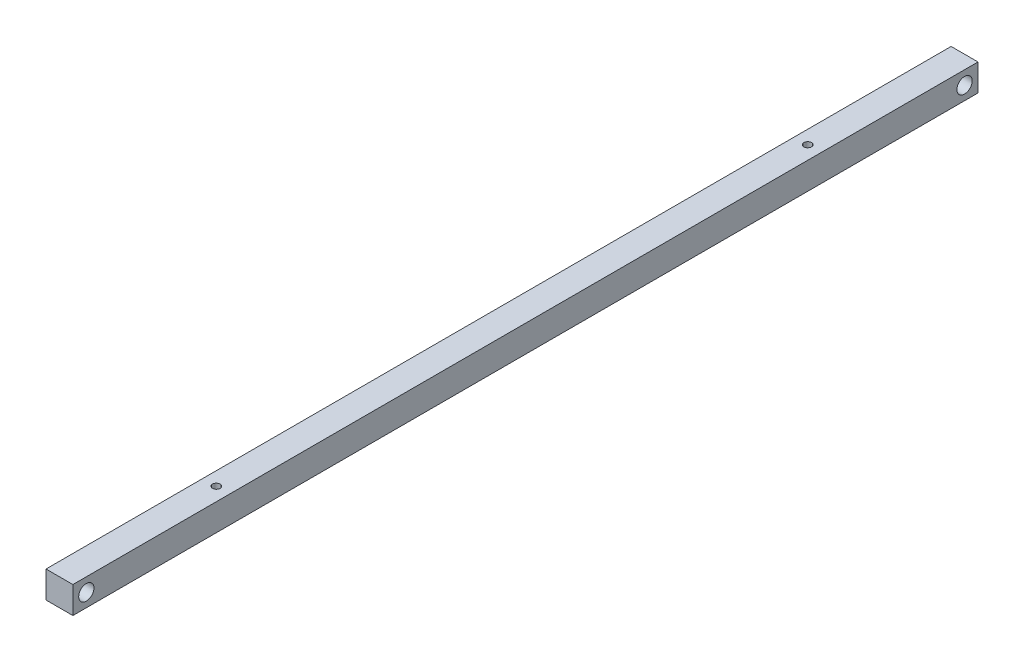
ISO-10303-21;
HEADER;
FILE_DESCRIPTION(('STEP AP214'),'2;1');
FILE_NAME('part.step','',(''),(''),'','','');
FILE_SCHEMA(('AUTOMOTIVE_DESIGN { 1 0 10303 214 1 1 1 1 }'));
ENDSEC;
DATA;
#1=APPLICATION_CONTEXT('core data for automotive mechanical design processes');
#2=APPLICATION_PROTOCOL_DEFINITION('international standard','automotive_design',2000,#1);
#3=PRODUCT_CONTEXT('',#1,'mechanical');
#4=PRODUCT('Part','Part','',(#3));
#5=PRODUCT_RELATED_PRODUCT_CATEGORY('part','',(#4));
#6=PRODUCT_DEFINITION_FORMATION('','',#4);
#7=PRODUCT_DEFINITION_CONTEXT('part definition',#1,'design');
#8=PRODUCT_DEFINITION('design','',#6,#7);
#9=PRODUCT_DEFINITION_SHAPE('','',#8);
#10=(LENGTH_UNIT() NAMED_UNIT(*) SI_UNIT(.MILLI.,.METRE.));
#11=(NAMED_UNIT(*) PLANE_ANGLE_UNIT() SI_UNIT($,.RADIAN.));
#12=(NAMED_UNIT(*) SI_UNIT($,.STERADIAN.) SOLID_ANGLE_UNIT());
#13=UNCERTAINTY_MEASURE_WITH_UNIT(LENGTH_MEASURE(1.E-05),#10,'distance_accuracy_value','');
#14=(GEOMETRIC_REPRESENTATION_CONTEXT(3) GLOBAL_UNCERTAINTY_ASSIGNED_CONTEXT((#13)) GLOBAL_UNIT_ASSIGNED_CONTEXT((#10,
#11,#12)) REPRESENTATION_CONTEXT('',''));
#15=CARTESIAN_POINT('',(0.,0.,0.));
#16=DIRECTION('',(0.,0.,1.));
#17=DIRECTION('',(1.,0.,0.));
#18=AXIS2_PLACEMENT_3D('',#15,#16,#17);
#19=CARTESIAN_POINT('',(7.5,-7.5,252.5));
#20=DIRECTION('',(-1.,0.,0.));
#21=DIRECTION('',(0.,0.,1.));
#22=AXIS2_PLACEMENT_3D('',#19,#20,#21);
#23=PLANE('',#22);
#24=CARTESIAN_POINT('',(7.5,0.,-245.));
#25=DIRECTION('',(-1.,0.,0.));
#26=DIRECTION('',(0.,0.,1.));
#27=AXIS2_PLACEMENT_3D('',#24,#25,#26);
#28=CIRCLE('',#27,4.25000000000001);
#29=CARTESIAN_POINT('',(7.5,0.,-240.75));
#30=VERTEX_POINT('',#29);
#31=EDGE_CURVE('E132',#30,#30,#28,.T.);
#32=ORIENTED_EDGE('',*,*,#31,.T.);
#33=EDGE_LOOP('',(#32));
#34=FACE_BOUND('',#33,.T.);
#35=CARTESIAN_POINT('',(7.5,0.,245.));
#36=DIRECTION('',(-1.,0.,0.));
#37=DIRECTION('',(0.,0.,1.));
#38=AXIS2_PLACEMENT_3D('',#35,#36,#37);
#39=CIRCLE('',#38,4.25000000000001);
#40=CARTESIAN_POINT('',(7.5,0.,249.25));
#41=VERTEX_POINT('',#40);
#42=EDGE_CURVE('E110',#41,#41,#39,.T.);
#43=ORIENTED_EDGE('',*,*,#42,.T.);
#44=EDGE_LOOP('',(#43));
#45=FACE_BOUND('',#44,.T.);
#46=DIRECTION('',(0.,1.,0.));
#47=VECTOR('',#46,1.);
#48=CARTESIAN_POINT('',(7.5,-7.5,-252.5));
#49=LINE('',#48,#47);
#50=CARTESIAN_POINT('',(7.5,-7.5,-252.5));
#51=VERTEX_POINT('',#50);
#52=CARTESIAN_POINT('',(7.5,7.5,-252.5));
#53=VERTEX_POINT('',#52);
#54=EDGE_CURVE('E107',#51,#53,#49,.T.);
#55=ORIENTED_EDGE('',*,*,#54,.T.);
#56=DIRECTION('',(0.,0.,-1.));
#57=VECTOR('',#56,1.);
#58=CARTESIAN_POINT('',(7.5,7.5,252.5));
#59=LINE('',#58,#57);
#60=CARTESIAN_POINT('',(7.5,7.5,252.5));
#61=VERTEX_POINT('',#60);
#62=EDGE_CURVE('E11',#61,#53,#59,.T.);
#63=ORIENTED_EDGE('',*,*,#62,.F.);
#64=DIRECTION('',(0.,1.,0.));
#65=VECTOR('',#64,1.);
#66=CARTESIAN_POINT('',(7.5,-7.5,252.5));
#67=LINE('',#66,#65);
#68=CARTESIAN_POINT('',(7.5,-7.5,252.5));
#69=VERTEX_POINT('',#68);
#70=EDGE_CURVE('E95',#69,#61,#67,.T.);
#71=ORIENTED_EDGE('',*,*,#70,.F.);
#72=DIRECTION('',(0.,0.,-1.));
#73=VECTOR('',#72,1.);
#74=CARTESIAN_POINT('',(7.5,-7.5,252.5));
#75=LINE('',#74,#73);
#76=EDGE_CURVE('E103',#69,#51,#75,.T.);
#77=ORIENTED_EDGE('',*,*,#76,.T.);
#78=EDGE_LOOP('',(#55,#63,#71,#77));
#79=FACE_BOUND('',#78,.T.);
#80=ADVANCED_FACE('F44',(#34,#45,#79),#23,.F.);
#81=CARTESIAN_POINT('',(-7.5,7.5,252.5));
#82=DIRECTION('',(0.,-1.,0.));
#83=DIRECTION('',(0.,0.,-1.));
#84=AXIS2_PLACEMENT_3D('',#81,#82,#83);
#85=PLANE('',#84);
#86=CARTESIAN_POINT('',(0.,7.5,-165.));
#87=DIRECTION('',(0.,-1.,0.));
#88=DIRECTION('',(0.,0.,-1.));
#89=AXIS2_PLACEMENT_3D('',#86,#87,#88);
#90=CIRCLE('',#89,2.1);
#91=CARTESIAN_POINT('',(0.,7.5,-167.1));
#92=VERTEX_POINT('',#91);
#93=EDGE_CURVE('E153',#92,#92,#90,.T.);
#94=ORIENTED_EDGE('',*,*,#93,.T.);
#95=EDGE_LOOP('',(#94));
#96=FACE_BOUND('',#95,.T.);
#97=CARTESIAN_POINT('',(0.,7.5,165.));
#98=DIRECTION('',(0.,-1.,0.));
#99=DIRECTION('',(0.,0.,-1.));
#100=AXIS2_PLACEMENT_3D('',#97,#98,#99);
#101=CIRCLE('',#100,2.1);
#102=CARTESIAN_POINT('',(0.,7.5,162.9));
#103=VERTEX_POINT('',#102);
#104=EDGE_CURVE('E144',#103,#103,#101,.T.);
#105=ORIENTED_EDGE('',*,*,#104,.T.);
#106=EDGE_LOOP('',(#105));
#107=FACE_BOUND('',#106,.T.);
#108=DIRECTION('',(-1.,0.,0.));
#109=VECTOR('',#108,1.);
#110=CARTESIAN_POINT('',(-7.5,7.5,-252.5));
#111=LINE('',#110,#109);
#112=CARTESIAN_POINT('',(-7.5,7.5,-252.5));
#113=VERTEX_POINT('',#112);
#114=EDGE_CURVE('E99',#53,#113,#111,.T.);
#115=ORIENTED_EDGE('',*,*,#114,.T.);
#116=DIRECTION('',(0.,0.,-1.));
#117=VECTOR('',#116,1.);
#118=CARTESIAN_POINT('',(-7.5,7.5,252.5));
#119=LINE('',#118,#117);
#120=CARTESIAN_POINT('',(-7.5,7.5,252.5));
#121=VERTEX_POINT('',#120);
#122=EDGE_CURVE('E52',#121,#113,#119,.T.);
#123=ORIENTED_EDGE('',*,*,#122,.F.);
#124=DIRECTION('',(-1.,0.,0.));
#125=VECTOR('',#124,1.);
#126=CARTESIAN_POINT('',(-7.5,7.5,252.5));
#127=LINE('',#126,#125);
#128=EDGE_CURVE('E90',#61,#121,#127,.T.);
#129=ORIENTED_EDGE('',*,*,#128,.F.);
#130=ORIENTED_EDGE('',*,*,#62,.T.);
#131=EDGE_LOOP('',(#115,#123,#129,#130));
#132=FACE_BOUND('',#131,.T.);
#133=ADVANCED_FACE('F98',(#96,#107,#132),#85,.F.);
#134=CARTESIAN_POINT('',(-7.5,-7.5,252.5));
#135=DIRECTION('',(1.,0.,0.));
#136=DIRECTION('',(0.,0.,-1.));
#137=AXIS2_PLACEMENT_3D('',#134,#135,#136);
#138=PLANE('',#137);
#139=CARTESIAN_POINT('',(-7.5,0.,-245.));
#140=DIRECTION('',(-1.,0.,0.));
#141=DIRECTION('',(0.,0.,1.));
#142=AXIS2_PLACEMENT_3D('',#139,#140,#141);
#143=CIRCLE('',#142,7.00000000000001);
#144=CARTESIAN_POINT('',(-7.5,0.,-238.));
#145=VERTEX_POINT('',#144);
#146=EDGE_CURVE('E141',#145,#145,#143,.T.);
#147=ORIENTED_EDGE('',*,*,#146,.F.);
#148=EDGE_LOOP('',(#147));
#149=FACE_BOUND('',#148,.T.);
#150=CARTESIAN_POINT('',(-7.5,0.,245.));
#151=DIRECTION('',(-1.,0.,0.));
#152=DIRECTION('',(0.,0.,1.));
#153=AXIS2_PLACEMENT_3D('',#150,#151,#152);
#154=CIRCLE('',#153,7.00000000000001);
#155=CARTESIAN_POINT('',(-7.5,0.,252.));
#156=VERTEX_POINT('',#155);
#157=EDGE_CURVE('E129',#156,#156,#154,.T.);
#158=ORIENTED_EDGE('',*,*,#157,.F.);
#159=EDGE_LOOP('',(#158));
#160=FACE_BOUND('',#159,.T.);
#161=DIRECTION('',(0.,-1.,0.));
#162=VECTOR('',#161,1.);
#163=CARTESIAN_POINT('',(-7.5,-7.5,-252.5));
#164=LINE('',#163,#162);
#165=CARTESIAN_POINT('',(-7.5,-7.5,-252.5));
#166=VERTEX_POINT('',#165);
#167=EDGE_CURVE('E77',#113,#166,#164,.T.);
#168=ORIENTED_EDGE('',*,*,#167,.T.);
#169=DIRECTION('',(0.,0.,-1.));
#170=VECTOR('',#169,1.);
#171=CARTESIAN_POINT('',(-7.5,-7.5,252.5));
#172=LINE('',#171,#170);
#173=CARTESIAN_POINT('',(-7.5,-7.5,252.5));
#174=VERTEX_POINT('',#173);
#175=EDGE_CURVE('E100',#174,#166,#172,.T.);
#176=ORIENTED_EDGE('',*,*,#175,.F.);
#177=DIRECTION('',(0.,-1.,0.));
#178=VECTOR('',#177,1.);
#179=CARTESIAN_POINT('',(-7.5,-7.5,252.5));
#180=LINE('',#179,#178);
#181=EDGE_CURVE('E93',#121,#174,#180,.T.);
#182=ORIENTED_EDGE('',*,*,#181,.F.);
#183=ORIENTED_EDGE('',*,*,#122,.T.);
#184=EDGE_LOOP('',(#168,#176,#182,#183));
#185=FACE_BOUND('',#184,.T.);
#186=ADVANCED_FACE('F101',(#149,#160,#185),#138,.F.);
#187=CARTESIAN_POINT('',(-7.5,-7.5,252.5));
#188=DIRECTION('',(0.,1.,0.));
#189=DIRECTION('',(0.,0.,1.));
#190=AXIS2_PLACEMENT_3D('',#187,#188,#189);
#191=PLANE('',#190);
#192=CARTESIAN_POINT('',(0.,-7.5,-165.));
#193=DIRECTION('',(0.,-1.,0.));
#194=DIRECTION('',(0.,0.,-1.));
#195=AXIS2_PLACEMENT_3D('',#192,#193,#194);
#196=CIRCLE('',#195,2.525);
#197=CARTESIAN_POINT('',(0.,-7.5,-167.525));
#198=VERTEX_POINT('',#197);
#199=EDGE_CURVE('E159',#198,#198,#196,.T.);
#200=ORIENTED_EDGE('',*,*,#199,.F.);
#201=EDGE_LOOP('',(#200));
#202=FACE_BOUND('',#201,.T.);
#203=CARTESIAN_POINT('',(0.,-7.5,165.));
#204=DIRECTION('',(0.,-1.,0.));
#205=DIRECTION('',(0.,0.,-1.));
#206=AXIS2_PLACEMENT_3D('',#203,#204,#205);
#207=CIRCLE('',#206,2.525);
#208=CARTESIAN_POINT('',(0.,-7.5,162.475));
#209=VERTEX_POINT('',#208);
#210=EDGE_CURVE('E150',#209,#209,#207,.T.);
#211=ORIENTED_EDGE('',*,*,#210,.F.);
#212=EDGE_LOOP('',(#211));
#213=FACE_BOUND('',#212,.T.);
#214=DIRECTION('',(1.,0.,0.));
#215=VECTOR('',#214,1.);
#216=CARTESIAN_POINT('',(-7.5,-7.5,-252.5));
#217=LINE('',#216,#215);
#218=EDGE_CURVE('E83',#166,#51,#217,.T.);
#219=ORIENTED_EDGE('',*,*,#218,.T.);
#220=ORIENTED_EDGE('',*,*,#76,.F.);
#221=DIRECTION('',(1.,0.,0.));
#222=VECTOR('',#221,1.);
#223=CARTESIAN_POINT('',(-7.5,-7.5,252.5));
#224=LINE('',#223,#222);
#225=EDGE_CURVE('E60',#174,#69,#224,.T.);
#226=ORIENTED_EDGE('',*,*,#225,.F.);
#227=ORIENTED_EDGE('',*,*,#175,.T.);
#228=EDGE_LOOP('',(#219,#220,#226,#227));
#229=FACE_BOUND('',#228,.T.);
#230=ADVANCED_FACE('F115',(#202,#213,#229),#191,.F.);
#231=CARTESIAN_POINT('',(0.,0.,252.5));
#232=DIRECTION('',(0.,0.,-1.));
#233=DIRECTION('',(-1.,0.,0.));
#234=AXIS2_PLACEMENT_3D('',#231,#232,#233);
#235=PLANE('',#234);
#236=ORIENTED_EDGE('',*,*,#70,.T.);
#237=ORIENTED_EDGE('',*,*,#128,.T.);
#238=ORIENTED_EDGE('',*,*,#181,.T.);
#239=ORIENTED_EDGE('',*,*,#225,.T.);
#240=EDGE_LOOP('',(#236,#237,#238,#239));
#241=FACE_BOUND('',#240,.T.);
#242=ADVANCED_FACE('F91',(#241),#235,.F.);
#243=CARTESIAN_POINT('',(0.,0.,-252.5));
#244=DIRECTION('',(0.,0.,-1.));
#245=DIRECTION('',(-1.,0.,0.));
#246=AXIS2_PLACEMENT_3D('',#243,#244,#245);
#247=PLANE('',#246);
#248=ORIENTED_EDGE('',*,*,#54,.F.);
#249=ORIENTED_EDGE('',*,*,#218,.F.);
#250=ORIENTED_EDGE('',*,*,#167,.F.);
#251=ORIENTED_EDGE('',*,*,#114,.F.);
#252=EDGE_LOOP('',(#248,#249,#250,#251));
#253=FACE_BOUND('',#252,.T.);
#254=ADVANCED_FACE('F118',(#253),#247,.T.);
#255=CARTESIAN_POINT('',(-7.5,0.,245.));
#256=DIRECTION('',(-1.,0.,0.));
#257=DIRECTION('',(0.,0.,1.));
#258=AXIS2_PLACEMENT_3D('',#255,#256,#257);
#259=CYLINDRICAL_SURFACE('',#258,4.25000000000001);
#260=ORIENTED_EDGE('',*,*,#42,.F.);
#261=EDGE_LOOP('',(#260));
#262=FACE_BOUND('',#261,.T.);
#263=CARTESIAN_POINT('',(0.499999999999999,0.,245.));
#264=DIRECTION('',(-1.,0.,0.));
#265=DIRECTION('',(0.,0.,1.));
#266=AXIS2_PLACEMENT_3D('',#263,#264,#265);
#267=CIRCLE('',#266,4.25000000000001);
#268=CARTESIAN_POINT('',(0.499999999999999,0.,249.25));
#269=VERTEX_POINT('',#268);
#270=EDGE_CURVE('E123',#269,#269,#267,.T.);
#271=ORIENTED_EDGE('',*,*,#270,.T.);
#272=EDGE_LOOP('',(#271));
#273=FACE_BOUND('',#272,.T.);
#274=ADVANCED_FACE('F198',(#262,#273),#259,.F.);
#275=CARTESIAN_POINT('',(0.499999999999999,4.25000000000001,245.));
#276=DIRECTION('',(1.,0.,0.));
#277=DIRECTION('',(0.,0.,-1.));
#278=AXIS2_PLACEMENT_3D('',#275,#276,#277);
#279=PLANE('',#278);
#280=ORIENTED_EDGE('',*,*,#270,.F.);
#281=EDGE_LOOP('',(#280));
#282=FACE_BOUND('',#281,.T.);
#283=CARTESIAN_POINT('',(0.499999999999999,0.,245.));
#284=DIRECTION('',(-1.,0.,0.));
#285=DIRECTION('',(0.,0.,1.));
#286=AXIS2_PLACEMENT_3D('',#283,#284,#285);
#287=CIRCLE('',#286,7.00000000000001);
#288=CARTESIAN_POINT('',(0.499999999999999,0.,252.));
#289=VERTEX_POINT('',#288);
#290=EDGE_CURVE('E126',#289,#289,#287,.T.);
#291=ORIENTED_EDGE('',*,*,#290,.T.);
#292=EDGE_LOOP('',(#291));
#293=FACE_BOUND('',#292,.T.);
#294=ADVANCED_FACE('F201',(#282,#293),#279,.F.);
#295=CARTESIAN_POINT('',(-7.5,0.,245.));
#296=DIRECTION('',(-1.,0.,0.));
#297=DIRECTION('',(0.,0.,1.));
#298=AXIS2_PLACEMENT_3D('',#295,#296,#297);
#299=CYLINDRICAL_SURFACE('',#298,7.00000000000001);
#300=ORIENTED_EDGE('',*,*,#290,.F.);
#301=EDGE_LOOP('',(#300));
#302=FACE_BOUND('',#301,.T.);
#303=ORIENTED_EDGE('',*,*,#157,.T.);
#304=EDGE_LOOP('',(#303));
#305=FACE_BOUND('',#304,.T.);
#306=ADVANCED_FACE('F207',(#302,#305),#299,.F.);
#307=CARTESIAN_POINT('',(-7.5,0.,-245.));
#308=DIRECTION('',(-1.,0.,0.));
#309=DIRECTION('',(0.,0.,1.));
#310=AXIS2_PLACEMENT_3D('',#307,#308,#309);
#311=CYLINDRICAL_SURFACE('',#310,4.25000000000001);
#312=ORIENTED_EDGE('',*,*,#31,.F.);
#313=EDGE_LOOP('',(#312));
#314=FACE_BOUND('',#313,.T.);
#315=CARTESIAN_POINT('',(0.499999999999999,0.,-245.));
#316=DIRECTION('',(-1.,0.,0.));
#317=DIRECTION('',(0.,0.,1.));
#318=AXIS2_PLACEMENT_3D('',#315,#316,#317);
#319=CIRCLE('',#318,4.25000000000001);
#320=CARTESIAN_POINT('',(0.499999999999999,0.,-240.75));
#321=VERTEX_POINT('',#320);
#322=EDGE_CURVE('E135',#321,#321,#319,.T.);
#323=ORIENTED_EDGE('',*,*,#322,.T.);
#324=EDGE_LOOP('',(#323));
#325=FACE_BOUND('',#324,.T.);
#326=ADVANCED_FACE('F213',(#314,#325),#311,.F.);
#327=CARTESIAN_POINT('',(0.499999999999999,4.25000000000001,-245.));
#328=DIRECTION('',(1.,0.,0.));
#329=DIRECTION('',(0.,0.,-1.));
#330=AXIS2_PLACEMENT_3D('',#327,#328,#329);
#331=PLANE('',#330);
#332=ORIENTED_EDGE('',*,*,#322,.F.);
#333=EDGE_LOOP('',(#332));
#334=FACE_BOUND('',#333,.T.);
#335=CARTESIAN_POINT('',(0.499999999999999,0.,-245.));
#336=DIRECTION('',(-1.,0.,0.));
#337=DIRECTION('',(0.,0.,1.));
#338=AXIS2_PLACEMENT_3D('',#335,#336,#337);
#339=CIRCLE('',#338,7.00000000000001);
#340=CARTESIAN_POINT('',(0.499999999999999,0.,-238.));
#341=VERTEX_POINT('',#340);
#342=EDGE_CURVE('E138',#341,#341,#339,.T.);
#343=ORIENTED_EDGE('',*,*,#342,.T.);
#344=EDGE_LOOP('',(#343));
#345=FACE_BOUND('',#344,.T.);
#346=ADVANCED_FACE('F230',(#334,#345),#331,.F.);
#347=CARTESIAN_POINT('',(-7.5,0.,-245.));
#348=DIRECTION('',(-1.,0.,0.));
#349=DIRECTION('',(0.,0.,1.));
#350=AXIS2_PLACEMENT_3D('',#347,#348,#349);
#351=CYLINDRICAL_SURFACE('',#350,7.00000000000001);
#352=ORIENTED_EDGE('',*,*,#342,.F.);
#353=EDGE_LOOP('',(#352));
#354=FACE_BOUND('',#353,.T.);
#355=ORIENTED_EDGE('',*,*,#146,.T.);
#356=EDGE_LOOP('',(#355));
#357=FACE_BOUND('',#356,.T.);
#358=ADVANCED_FACE('F182',(#354,#357),#351,.F.);
#359=CARTESIAN_POINT('',(0.,-7.5,165.));
#360=DIRECTION('',(0.,-1.,0.));
#361=DIRECTION('',(0.,0.,-1.));
#362=AXIS2_PLACEMENT_3D('',#359,#360,#361);
#363=CYLINDRICAL_SURFACE('',#362,2.09999999999999);
#364=ORIENTED_EDGE('',*,*,#104,.F.);
#365=EDGE_LOOP('',(#364));
#366=FACE_BOUND('',#365,.T.);
#367=CARTESIAN_POINT('',(0.,-7.07499999999999,165.));
#368=DIRECTION('',(0.,-1.,0.));
#369=DIRECTION('',(0.,0.,-1.));
#370=AXIS2_PLACEMENT_3D('',#367,#368,#369);
#371=CIRCLE('',#370,2.09999999999999);
#372=CARTESIAN_POINT('',(0.,-7.07499999999999,162.9));
#373=VERTEX_POINT('',#372);
#374=EDGE_CURVE('E147',#373,#373,#371,.T.);
#375=ORIENTED_EDGE('',*,*,#374,.T.);
#376=EDGE_LOOP('',(#375));
#377=FACE_BOUND('',#376,.T.);
#378=ADVANCED_FACE('F173',(#366,#377),#363,.F.);
#379=CARTESIAN_POINT('',(0.,-7.5,165.));
#380=DIRECTION('',(0.,-1.,0.));
#381=DIRECTION('',(0.,0.,-1.));
#382=AXIS2_PLACEMENT_3D('',#379,#380,#381);
#383=CONICAL_SURFACE('',#382,2.525,0.78539816339745);
#384=ORIENTED_EDGE('',*,*,#374,.F.);
#385=EDGE_LOOP('',(#384));
#386=FACE_BOUND('',#385,.T.);
#387=ORIENTED_EDGE('',*,*,#210,.T.);
#388=EDGE_LOOP('',(#387));
#389=FACE_BOUND('',#388,.T.);
#390=ADVANCED_FACE('F170',(#386,#389),#383,.F.);
#391=CARTESIAN_POINT('',(0.,-7.5,-165.));
#392=DIRECTION('',(0.,-1.,0.));
#393=DIRECTION('',(0.,0.,-1.));
#394=AXIS2_PLACEMENT_3D('',#391,#392,#393);
#395=CYLINDRICAL_SURFACE('',#394,2.09999999999999);
#396=ORIENTED_EDGE('',*,*,#93,.F.);
#397=EDGE_LOOP('',(#396));
#398=FACE_BOUND('',#397,.T.);
#399=CARTESIAN_POINT('',(0.,-7.07499999999999,-165.));
#400=DIRECTION('',(0.,-1.,0.));
#401=DIRECTION('',(0.,0.,-1.));
#402=AXIS2_PLACEMENT_3D('',#399,#400,#401);
#403=CIRCLE('',#402,2.09999999999999);
#404=CARTESIAN_POINT('',(0.,-7.07499999999999,-167.1));
#405=VERTEX_POINT('',#404);
#406=EDGE_CURVE('E156',#405,#405,#403,.T.);
#407=ORIENTED_EDGE('',*,*,#406,.T.);
#408=EDGE_LOOP('',(#407));
#409=FACE_BOUND('',#408,.T.);
#410=ADVANCED_FACE('F172',(#398,#409),#395,.F.);
#411=CARTESIAN_POINT('',(0.,-7.5,-165.));
#412=DIRECTION('',(0.,-1.,0.));
#413=DIRECTION('',(0.,0.,-1.));
#414=AXIS2_PLACEMENT_3D('',#411,#412,#413);
#415=CONICAL_SURFACE('',#414,2.525,0.78539816339745);
#416=ORIENTED_EDGE('',*,*,#406,.F.);
#417=EDGE_LOOP('',(#416));
#418=FACE_BOUND('',#417,.T.);
#419=ORIENTED_EDGE('',*,*,#199,.T.);
#420=EDGE_LOOP('',(#419));
#421=FACE_BOUND('',#420,.T.);
#422=ADVANCED_FACE('F163',(#418,#421),#415,.F.);
#423=CLOSED_SHELL('',(#80,#133,#186,#230,#242,#254,#274,#294,#306,#326,#346,#358,#378,#390,#410,#422));
#424=MANIFOLD_SOLID_BREP('B2',#423);
#425=ADVANCED_BREP_SHAPE_REPRESENTATION('',(#18,#424),#14);
#426=SHAPE_DEFINITION_REPRESENTATION(#9,#425);
ENDSEC;
END-ISO-10303-21;
